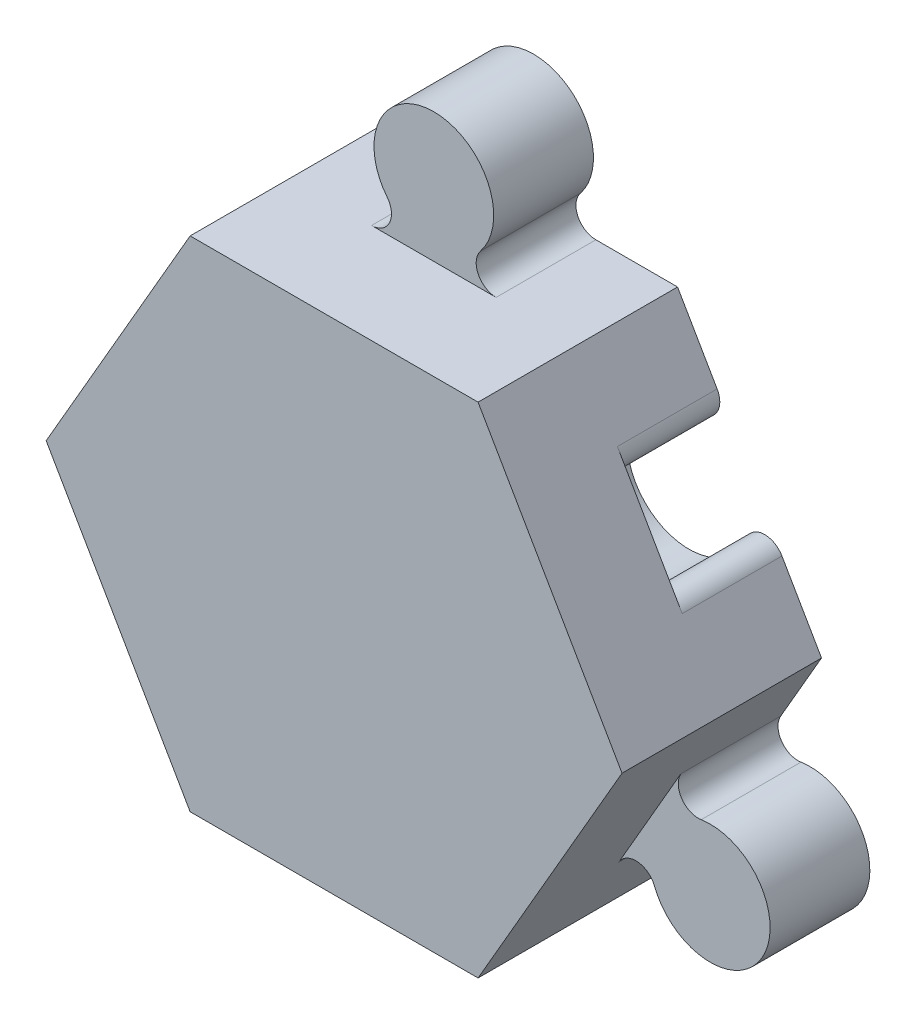
ISO-10303-21;
HEADER;
FILE_DESCRIPTION(('STEP AP214'),'2;1');
FILE_NAME('part.step','',(''),(''),'','','');
FILE_SCHEMA(('AUTOMOTIVE_DESIGN { 1 0 10303 214 1 1 1 1 }'));
ENDSEC;
DATA;
#1=APPLICATION_CONTEXT('core data for automotive mechanical design processes');
#2=APPLICATION_PROTOCOL_DEFINITION('international standard','automotive_design',2000,#1);
#3=PRODUCT_CONTEXT('',#1,'mechanical');
#4=PRODUCT('Part','Part','',(#3));
#5=PRODUCT_RELATED_PRODUCT_CATEGORY('part','',(#4));
#6=PRODUCT_DEFINITION_FORMATION('','',#4);
#7=PRODUCT_DEFINITION_CONTEXT('part definition',#1,'design');
#8=PRODUCT_DEFINITION('design','',#6,#7);
#9=PRODUCT_DEFINITION_SHAPE('','',#8);
#10=(LENGTH_UNIT() NAMED_UNIT(*) SI_UNIT(.MILLI.,.METRE.));
#11=(NAMED_UNIT(*) PLANE_ANGLE_UNIT() SI_UNIT($,.RADIAN.));
#12=(NAMED_UNIT(*) SI_UNIT($,.STERADIAN.) SOLID_ANGLE_UNIT());
#13=UNCERTAINTY_MEASURE_WITH_UNIT(LENGTH_MEASURE(1.E-05),#10,'distance_accuracy_value','');
#14=(GEOMETRIC_REPRESENTATION_CONTEXT(3) GLOBAL_UNCERTAINTY_ASSIGNED_CONTEXT((#13)) GLOBAL_UNIT_ASSIGNED_CONTEXT((#10,
#11,#12)) REPRESENTATION_CONTEXT('',''));
#15=CARTESIAN_POINT('',(0.,0.,0.));
#16=DIRECTION('',(0.,0.,1.));
#17=DIRECTION('',(1.,0.,0.));
#18=AXIS2_PLACEMENT_3D('',#15,#16,#17);
#19=CARTESIAN_POINT('',(-14.4337567297406,-1.00790384542582E-13,10.));
#20=DIRECTION('',(0.866025403784435,0.500000000000007,0.));
#21=DIRECTION('',(-0.500000000000007,0.866025403784435,0.));
#22=AXIS2_PLACEMENT_3D('',#19,#20,#21);
#23=PLANE('',#22);
#24=DIRECTION('',(0.,0.,-1.));
#25=VECTOR('',#24,1.);
#26=CARTESIAN_POINT('',(-9.26406804770591,-8.95416345659787,5.));
#27=LINE('',#26,#25);
#28=CARTESIAN_POINT('',(-9.26406804770591,-8.95416345659779,5.));
#29=VERTEX_POINT('',#28);
#30=CARTESIAN_POINT('',(-9.26406804770591,-8.95416345659787,0.));
#31=VERTEX_POINT('',#30);
#32=EDGE_CURVE('E351',#29,#31,#27,.T.);
#33=ORIENTED_EDGE('',*,*,#32,.T.);
#34=DIRECTION('',(0.500000000000007,-0.866025403784435,0.));
#35=VECTOR('',#34,1.);
#36=CARTESIAN_POINT('',(-14.4337567297406,-1.00790384542582E-13,0.));
#37=LINE('',#36,#35);
#38=CARTESIAN_POINT('',(-7.21687836487018,-12.5,0.));
#39=VERTEX_POINT('',#38);
#40=EDGE_CURVE('E525',#31,#39,#37,.T.);
#41=ORIENTED_EDGE('',*,*,#40,.T.);
#42=DIRECTION('',(0.,0.,-1.));
#43=VECTOR('',#42,1.);
#44=CARTESIAN_POINT('',(-7.21687836487018,-12.5,10.));
#45=LINE('',#44,#43);
#46=CARTESIAN_POINT('',(-7.21687836487018,-12.5,10.));
#47=VERTEX_POINT('',#46);
#48=EDGE_CURVE('E536',#47,#39,#45,.T.);
#49=ORIENTED_EDGE('',*,*,#48,.F.);
#50=DIRECTION('',(0.500000000000007,-0.866025403784435,0.));
#51=VECTOR('',#50,1.);
#52=CARTESIAN_POINT('',(-14.4337567297406,-1.00790384542582E-13,10.));
#53=LINE('',#52,#51);
#54=CARTESIAN_POINT('',(-14.4337567297406,-1.00790384542582E-13,10.));
#55=VERTEX_POINT('',#54);
#56=EDGE_CURVE('E501',#55,#47,#53,.T.);
#57=ORIENTED_EDGE('',*,*,#56,.F.);
#58=DIRECTION('',(0.,0.,-1.));
#59=VECTOR('',#58,1.);
#60=CARTESIAN_POINT('',(-14.4337567297406,-1.00790384542582E-13,10.));
#61=LINE('',#60,#59);
#62=CARTESIAN_POINT('',(-14.4337567297406,-1.00790384542582E-13,0.));
#63=VERTEX_POINT('',#62);
#64=EDGE_CURVE('E540',#55,#63,#61,.T.);
#65=ORIENTED_EDGE('',*,*,#64,.T.);
#66=CARTESIAN_POINT('',(-12.3865670469051,-3.54583654340188,0.));
#67=VERTEX_POINT('',#66);
#68=EDGE_CURVE('E526',#63,#67,#37,.T.);
#69=ORIENTED_EDGE('',*,*,#68,.T.);
#70=DIRECTION('',(0.,0.,-1.));
#71=VECTOR('',#70,1.);
#72=CARTESIAN_POINT('',(-12.3865670469051,-3.54583654340187,5.));
#73=LINE('',#72,#71);
#74=CARTESIAN_POINT('',(-12.3865670469051,-3.54583654340187,5.));
#75=VERTEX_POINT('',#74);
#76=EDGE_CURVE('E356',#75,#67,#73,.T.);
#77=ORIENTED_EDGE('',*,*,#76,.F.);
#78=DIRECTION('',(0.499999999999995,-0.866025403784442,0.));
#79=VECTOR('',#78,1.);
#80=CARTESIAN_POINT('',(-12.3865670469051,-3.54583654340187,5.));
#81=LINE('',#80,#79);
#82=EDGE_CURVE('E337',#75,#29,#81,.T.);
#83=ORIENTED_EDGE('',*,*,#82,.T.);
#84=EDGE_LOOP('',(#33,#41,#49,#57,#65,#69,#77,#83));
#85=FACE_BOUND('',#84,.T.);
#86=ADVANCED_FACE('F40',(#85),#23,.F.);
#87=CARTESIAN_POINT('',(7.21687836487044,-12.4999999999999,10.));
#88=DIRECTION('',(-0.866025403784441,0.499999999999995,0.));
#89=DIRECTION('',(-0.499999999999995,-0.866025403784441,0.));
#90=AXIS2_PLACEMENT_3D('',#87,#88,#89);
#91=PLANE('',#90);
#92=DIRECTION('',(0.,0.,-1.));
#93=VECTOR('',#92,1.);
#94=CARTESIAN_POINT('',(12.386567046905,-3.54583654340204,5.));
#95=LINE('',#94,#93);
#96=CARTESIAN_POINT('',(12.386567046905,-3.54583654340204,5.));
#97=VERTEX_POINT('',#96);
#98=CARTESIAN_POINT('',(12.386567046905,-3.54583654340204,0.));
#99=VERTEX_POINT('',#98);
#100=EDGE_CURVE('E392',#97,#99,#95,.T.);
#101=ORIENTED_EDGE('',*,*,#100,.T.);
#102=DIRECTION('',(0.499999999999995,0.866025403784441,0.));
#103=VECTOR('',#102,1.);
#104=CARTESIAN_POINT('',(7.21687836487044,-12.4999999999999,0.));
#105=LINE('',#104,#103);
#106=CARTESIAN_POINT('',(14.4337567297406,0.,0.));
#107=VERTEX_POINT('',#106);
#108=EDGE_CURVE('E477',#99,#107,#105,.T.);
#109=ORIENTED_EDGE('',*,*,#108,.T.);
#110=DIRECTION('',(0.,0.,-1.));
#111=VECTOR('',#110,1.);
#112=CARTESIAN_POINT('',(14.4337567297406,0.,10.));
#113=LINE('',#112,#111);
#114=CARTESIAN_POINT('',(14.4337567297406,0.,10.));
#115=VERTEX_POINT('',#114);
#116=EDGE_CURVE('E11',#115,#107,#113,.T.);
#117=ORIENTED_EDGE('',*,*,#116,.F.);
#118=DIRECTION('',(0.499999999999995,0.866025403784441,0.));
#119=VECTOR('',#118,1.);
#120=CARTESIAN_POINT('',(7.21687836487044,-12.4999999999999,10.));
#121=LINE('',#120,#119);
#122=CARTESIAN_POINT('',(7.21687836487044,-12.4999999999999,10.));
#123=VERTEX_POINT('',#122);
#124=EDGE_CURVE('E487',#123,#115,#121,.T.);
#125=ORIENTED_EDGE('',*,*,#124,.F.);
#126=DIRECTION('',(0.,0.,-1.));
#127=VECTOR('',#126,1.);
#128=CARTESIAN_POINT('',(7.21687836487044,-12.4999999999999,10.));
#129=LINE('',#128,#127);
#130=CARTESIAN_POINT('',(7.21687836487044,-12.4999999999999,0.));
#131=VERTEX_POINT('',#130);
#132=EDGE_CURVE('E507',#123,#131,#129,.T.);
#133=ORIENTED_EDGE('',*,*,#132,.T.);
#134=CARTESIAN_POINT('',(9.26406804770586,-8.95416345659806,0.));
#135=VERTEX_POINT('',#134);
#136=EDGE_CURVE('E508',#131,#135,#105,.T.);
#137=ORIENTED_EDGE('',*,*,#136,.T.);
#138=DIRECTION('',(0.,0.,-1.));
#139=VECTOR('',#138,1.);
#140=CARTESIAN_POINT('',(9.26406804770581,-8.95416345659802,5.));
#141=LINE('',#140,#139);
#142=CARTESIAN_POINT('',(9.26406804770581,-8.95416345659815,5.));
#143=VERTEX_POINT('',#142);
#144=EDGE_CURVE('E397',#143,#135,#141,.T.);
#145=ORIENTED_EDGE('',*,*,#144,.F.);
#146=DIRECTION('',(0.500000000000001,0.866025403784438,0.));
#147=VECTOR('',#146,1.);
#148=CARTESIAN_POINT('',(9.26406804770581,-8.95416345659802,5.));
#149=LINE('',#148,#147);
#150=EDGE_CURVE('E378',#143,#97,#149,.T.);
#151=ORIENTED_EDGE('',*,*,#150,.T.);
#152=EDGE_LOOP('',(#101,#109,#117,#125,#133,#137,#145,#151));
#153=FACE_BOUND('',#152,.T.);
#154=ADVANCED_FACE('F42',(#153),#91,.F.);
#155=CARTESIAN_POINT('',(7.21687836487027,12.5,10.));
#156=DIRECTION('',(0.,-1.,0.));
#157=DIRECTION('',(1.,0.,0.));
#158=AXIS2_PLACEMENT_3D('',#155,#156,#157);
#159=PLANE('',#158);
#160=DIRECTION('',(0.,0.,-1.));
#161=VECTOR('',#160,1.);
#162=CARTESIAN_POINT('',(-3.1224989991992,12.4999999999999,5.));
#163=LINE('',#162,#161);
#164=CARTESIAN_POINT('',(-3.1224989991992,12.4999999999999,5.));
#165=VERTEX_POINT('',#164);
#166=CARTESIAN_POINT('',(-3.1224989991992,12.4999999999999,0.));
#167=VERTEX_POINT('',#166);
#168=EDGE_CURVE('E473',#165,#167,#163,.T.);
#169=ORIENTED_EDGE('',*,*,#168,.T.);
#170=DIRECTION('',(-1.,0.,0.));
#171=VECTOR('',#170,1.);
#172=CARTESIAN_POINT('',(7.21687836487027,12.5,0.));
#173=LINE('',#172,#171);
#174=CARTESIAN_POINT('',(-7.21687836487035,12.4999999999999,0.));
#175=VERTEX_POINT('',#174);
#176=EDGE_CURVE('E516',#167,#175,#173,.T.);
#177=ORIENTED_EDGE('',*,*,#176,.T.);
#178=DIRECTION('',(0.,0.,-1.));
#179=VECTOR('',#178,1.);
#180=CARTESIAN_POINT('',(-7.21687836487035,12.4999999999999,10.));
#181=LINE('',#180,#179);
#182=CARTESIAN_POINT('',(-7.21687836487035,12.4999999999999,10.));
#183=VERTEX_POINT('',#182);
#184=EDGE_CURVE('E544',#183,#175,#181,.T.);
#185=ORIENTED_EDGE('',*,*,#184,.F.);
#186=DIRECTION('',(-1.,0.,0.));
#187=VECTOR('',#186,1.);
#188=CARTESIAN_POINT('',(7.21687836487027,12.5,10.));
#189=LINE('',#188,#187);
#190=CARTESIAN_POINT('',(7.21687836487027,12.5,10.));
#191=VERTEX_POINT('',#190);
#192=EDGE_CURVE('E495',#191,#183,#189,.T.);
#193=ORIENTED_EDGE('',*,*,#192,.F.);
#194=DIRECTION('',(0.,0.,-1.));
#195=VECTOR('',#194,1.);
#196=CARTESIAN_POINT('',(7.21687836487027,12.5,10.));
#197=LINE('',#196,#195);
#198=CARTESIAN_POINT('',(7.21687836487027,12.5,0.));
#199=VERTEX_POINT('',#198);
#200=EDGE_CURVE('E49',#191,#199,#197,.T.);
#201=ORIENTED_EDGE('',*,*,#200,.T.);
#202=CARTESIAN_POINT('',(3.1224989991992,12.5,0.));
#203=VERTEX_POINT('',#202);
#204=EDGE_CURVE('E517',#199,#203,#173,.T.);
#205=ORIENTED_EDGE('',*,*,#204,.T.);
#206=DIRECTION('',(0.,0.,-1.));
#207=VECTOR('',#206,1.);
#208=CARTESIAN_POINT('',(3.1224989991992,12.5,5.));
#209=LINE('',#208,#207);
#210=CARTESIAN_POINT('',(3.1224989991992,12.5,5.));
#211=VERTEX_POINT('',#210);
#212=EDGE_CURVE('E478',#211,#203,#209,.T.);
#213=ORIENTED_EDGE('',*,*,#212,.F.);
#214=DIRECTION('',(-1.,0.,0.));
#215=VECTOR('',#214,1.);
#216=CARTESIAN_POINT('',(3.1224989991992,12.5,5.));
#217=LINE('',#216,#215);
#218=EDGE_CURVE('E459',#211,#165,#217,.T.);
#219=ORIENTED_EDGE('',*,*,#218,.T.);
#220=EDGE_LOOP('',(#169,#177,#185,#193,#201,#205,#213,#219));
#221=FACE_BOUND('',#220,.T.);
#222=ADVANCED_FACE('F553',(#221),#159,.F.);
#223=CARTESIAN_POINT('',(14.4337567297406,0.,10.));
#224=DIRECTION('',(-0.866025403784438,-0.500000000000001,0.));
#225=DIRECTION('',(0.500000000000001,-0.866025403784438,0.));
#226=AXIS2_PLACEMENT_3D('',#223,#224,#225);
#227=PLANE('',#226);
#228=DIRECTION('',(-0.500000000000001,0.866025403784438,0.));
#229=VECTOR('',#228,1.);
#230=CARTESIAN_POINT('',(14.4337567297406,0.,0.));
#231=LINE('',#230,#229);
#232=CARTESIAN_POINT('',(12.4501252282327,3.43575054410582,0.));
#233=VERTEX_POINT('',#232);
#234=EDGE_CURVE('E512',#107,#233,#231,.T.);
#235=ORIENTED_EDGE('',*,*,#234,.T.);
#236=DIRECTION('',(0.,0.,-1.));
#237=VECTOR('',#236,1.);
#238=CARTESIAN_POINT('',(12.4501252282327,3.43575054410582,5.));
#239=LINE('',#238,#237);
#240=CARTESIAN_POINT('',(12.4501252282327,3.43575054410582,5.));
#241=VERTEX_POINT('',#240);
#242=EDGE_CURVE('E274',#241,#233,#239,.T.);
#243=ORIENTED_EDGE('',*,*,#242,.F.);
#244=DIRECTION('',(0.500000000000001,-0.866025403784438,0.));
#245=VECTOR('',#244,1.);
#246=CARTESIAN_POINT('',(10.8253175473054,6.24999999999999,5.));
#247=LINE('',#246,#245);
#248=CARTESIAN_POINT('',(9.2005098663783,9.06424945589393,5.));
#249=VERTEX_POINT('',#248);
#250=EDGE_CURVE('E299',#249,#241,#247,.T.);
#251=ORIENTED_EDGE('',*,*,#250,.F.);
#252=DIRECTION('',(0.,0.,-1.));
#253=VECTOR('',#252,1.);
#254=CARTESIAN_POINT('',(9.2005098663783,9.06424945589393,5.));
#255=LINE('',#254,#253);
#256=CARTESIAN_POINT('',(9.2005098663783,9.06424945589393,0.));
#257=VERTEX_POINT('',#256);
#258=EDGE_CURVE('E315',#249,#257,#255,.T.);
#259=ORIENTED_EDGE('',*,*,#258,.T.);
#260=EDGE_CURVE('E511',#257,#199,#231,.T.);
#261=ORIENTED_EDGE('',*,*,#260,.T.);
#262=ORIENTED_EDGE('',*,*,#200,.F.);
#263=DIRECTION('',(-0.500000000000001,0.866025403784438,0.));
#264=VECTOR('',#263,1.);
#265=CARTESIAN_POINT('',(14.4337567297406,0.,10.));
#266=LINE('',#265,#264);
#267=EDGE_CURVE('E491',#115,#191,#266,.T.);
#268=ORIENTED_EDGE('',*,*,#267,.F.);
#269=ORIENTED_EDGE('',*,*,#116,.T.);
#270=EDGE_LOOP('',(#235,#243,#251,#259,#261,#262,#268,#269));
#271=FACE_BOUND('',#270,.T.);
#272=ADVANCED_FACE('F588',(#271),#227,.F.);
#273=CARTESIAN_POINT('',(-7.21687836487035,12.4999999999999,10.));
#274=DIRECTION('',(0.866025403784442,-0.499999999999995,0.));
#275=DIRECTION('',(0.499999999999995,0.866025403784442,0.));
#276=AXIS2_PLACEMENT_3D('',#273,#274,#275);
#277=PLANE('',#276);
#278=DIRECTION('',(-0.499999999999995,-0.866025403784441,0.));
#279=VECTOR('',#278,1.);
#280=CARTESIAN_POINT('',(-7.21687836487035,12.4999999999999,0.));
#281=LINE('',#280,#279);
#282=CARTESIAN_POINT('',(-9.20050986637823,9.06424945589409,0.));
#283=VERTEX_POINT('',#282);
#284=EDGE_CURVE('E521',#175,#283,#281,.T.);
#285=ORIENTED_EDGE('',*,*,#284,.T.);
#286=DIRECTION('',(0.,0.,-1.));
#287=VECTOR('',#286,1.);
#288=CARTESIAN_POINT('',(-9.20050986637823,9.06424945589409,5.));
#289=LINE('',#288,#287);
#290=CARTESIAN_POINT('',(-9.20050986637823,9.06424945589409,5.));
#291=VERTEX_POINT('',#290);
#292=EDGE_CURVE('E277',#291,#283,#289,.T.);
#293=ORIENTED_EDGE('',*,*,#292,.F.);
#294=DIRECTION('',(0.499999999999995,0.866025403784442,0.));
#295=VECTOR('',#294,1.);
#296=CARTESIAN_POINT('',(-10.8253175473055,6.24999999999991,5.));
#297=LINE('',#296,#295);
#298=CARTESIAN_POINT('',(-12.4501252282326,3.43575054410596,5.));
#299=VERTEX_POINT('',#298);
#300=EDGE_CURVE('E246',#299,#291,#297,.T.);
#301=ORIENTED_EDGE('',*,*,#300,.F.);
#302=DIRECTION('',(0.,0.,-1.));
#303=VECTOR('',#302,1.);
#304=CARTESIAN_POINT('',(-12.4501252282326,3.43575054410596,5.));
#305=LINE('',#304,#303);
#306=CARTESIAN_POINT('',(-12.4501252282326,3.43575054410596,0.));
#307=VERTEX_POINT('',#306);
#308=EDGE_CURVE('E281',#299,#307,#305,.T.);
#309=ORIENTED_EDGE('',*,*,#308,.T.);
#310=EDGE_CURVE('E520',#307,#63,#281,.T.);
#311=ORIENTED_EDGE('',*,*,#310,.T.);
#312=ORIENTED_EDGE('',*,*,#64,.F.);
#313=DIRECTION('',(-0.499999999999995,-0.866025403784441,0.));
#314=VECTOR('',#313,1.);
#315=CARTESIAN_POINT('',(-7.21687836487035,12.4999999999999,10.));
#316=LINE('',#315,#314);
#317=EDGE_CURVE('E498',#183,#55,#316,.T.);
#318=ORIENTED_EDGE('',*,*,#317,.F.);
#319=ORIENTED_EDGE('',*,*,#184,.T.);
#320=EDGE_LOOP('',(#285,#293,#301,#309,#311,#312,#318,#319));
#321=FACE_BOUND('',#320,.T.);
#322=ADVANCED_FACE('F631',(#321),#277,.F.);
#323=CARTESIAN_POINT('',(-7.21687836487018,-12.5,10.));
#324=DIRECTION('',(0.,1.,0.));
#325=DIRECTION('',(-1.,0.,0.));
#326=AXIS2_PLACEMENT_3D('',#323,#324,#325);
#327=PLANE('',#326);
#328=DIRECTION('',(1.,0.,0.));
#329=VECTOR('',#328,1.);
#330=CARTESIAN_POINT('',(-7.21687836487018,-12.5,0.));
#331=LINE('',#330,#329);
#332=CARTESIAN_POINT('',(-3.24961536185439,-12.5,0.));
#333=VERTEX_POINT('',#332);
#334=EDGE_CURVE('E492',#39,#333,#331,.T.);
#335=ORIENTED_EDGE('',*,*,#334,.T.);
#336=DIRECTION('',(0.,0.,-1.));
#337=VECTOR('',#336,1.);
#338=CARTESIAN_POINT('',(-3.24961536185439,-12.5,5.));
#339=LINE('',#338,#337);
#340=CARTESIAN_POINT('',(-3.24961536185439,-12.5,5.));
#341=VERTEX_POINT('',#340);
#342=EDGE_CURVE('E432',#341,#333,#339,.T.);
#343=ORIENTED_EDGE('',*,*,#342,.F.);
#344=DIRECTION('',(-1.,0.,0.));
#345=VECTOR('',#344,1.);
#346=CARTESIAN_POINT('',(1.3220368468887E-13,-12.4999999999999,5.));
#347=LINE('',#346,#345);
#348=CARTESIAN_POINT('',(3.24961536185438,-12.4999999999999,5.));
#349=VERTEX_POINT('',#348);
#350=EDGE_CURVE('E418',#349,#341,#347,.T.);
#351=ORIENTED_EDGE('',*,*,#350,.F.);
#352=DIRECTION('',(0.,0.,-1.));
#353=VECTOR('',#352,1.);
#354=CARTESIAN_POINT('',(3.24961536185438,-12.4999999999999,5.));
#355=LINE('',#354,#353);
#356=CARTESIAN_POINT('',(3.24961536185438,-12.4999999999999,0.));
#357=VERTEX_POINT('',#356);
#358=EDGE_CURVE('E436',#349,#357,#355,.T.);
#359=ORIENTED_EDGE('',*,*,#358,.T.);
#360=EDGE_CURVE('E529',#357,#131,#331,.T.);
#361=ORIENTED_EDGE('',*,*,#360,.T.);
#362=ORIENTED_EDGE('',*,*,#132,.F.);
#363=DIRECTION('',(1.,0.,0.));
#364=VECTOR('',#363,1.);
#365=CARTESIAN_POINT('',(-7.21687836487018,-12.5,10.));
#366=LINE('',#365,#364);
#367=EDGE_CURVE('E504',#47,#123,#366,.T.);
#368=ORIENTED_EDGE('',*,*,#367,.F.);
#369=ORIENTED_EDGE('',*,*,#48,.T.);
#370=EDGE_LOOP('',(#335,#343,#351,#359,#361,#362,#368,#369));
#371=FACE_BOUND('',#370,.T.);
#372=ADVANCED_FACE('F629',(#371),#327,.F.);
#373=CARTESIAN_POINT('',(0.,0.,10.));
#374=DIRECTION('',(0.,0.,1.));
#375=DIRECTION('',(1.,0.,0.));
#376=AXIS2_PLACEMENT_3D('',#373,#374,#375);
#377=PLANE('',#376);
#378=ORIENTED_EDGE('',*,*,#124,.T.);
#379=ORIENTED_EDGE('',*,*,#267,.T.);
#380=ORIENTED_EDGE('',*,*,#192,.T.);
#381=ORIENTED_EDGE('',*,*,#317,.T.);
#382=ORIENTED_EDGE('',*,*,#56,.T.);
#383=ORIENTED_EDGE('',*,*,#367,.T.);
#384=EDGE_LOOP('',(#378,#379,#380,#381,#382,#383));
#385=FACE_BOUND('',#384,.T.);
#386=ADVANCED_FACE('F590',(#385),#377,.T.);
#387=CARTESIAN_POINT('',(0.,0.,0.));
#388=DIRECTION('',(0.,0.,1.));
#389=DIRECTION('',(1.,0.,0.));
#390=AXIS2_PLACEMENT_3D('',#387,#388,#389);
#391=PLANE('',#390);
#392=CARTESIAN_POINT('',(-7.79422863405995,4.50000000000005,0.));
#393=DIRECTION('',(0.,0.,-1.));
#394=DIRECTION('',(0.500000000000004,0.866025403784436,0.));
#395=AXIS2_PLACEMENT_3D('',#392,#393,#394);
#396=CIRCLE('',#395,3.1);
#397=CARTESIAN_POINT('',(-8.20271474831728,7.572969100798,0.));
#398=VERTEX_POINT('',#397);
#399=CARTESIAN_POINT('',(-10.6597409975243,3.31727480164114,0.));
#400=VERTEX_POINT('',#399);
#401=EDGE_CURVE('E265',#398,#400,#396,.T.);
#402=ORIENTED_EDGE('',*,*,#401,.F.);
#403=CARTESIAN_POINT('',(-8.33448446259384,8.56424945589411,0.));
#404=DIRECTION('',(0.,0.,-1.));
#405=DIRECTION('',(0.500000000000004,0.866025403784436,0.));
#406=AXIS2_PLACEMENT_3D('',#403,#404,#405);
#407=CIRCLE('',#406,0.999999999999999);
#408=EDGE_CURVE('E56',#283,#398,#407,.F.);
#409=ORIENTED_EDGE('',*,*,#408,.F.);
#410=ORIENTED_EDGE('',*,*,#284,.F.);
#411=ORIENTED_EDGE('',*,*,#176,.F.);
#412=CARTESIAN_POINT('',(-3.1224989991992,13.5,0.));
#413=DIRECTION('',(0.,0.,1.));
#414=DIRECTION('',(-1.,0.,0.));
#415=AXIS2_PLACEMENT_3D('',#412,#413,#414);
#416=CIRCLE('',#415,1.00000000000002);
#417=CARTESIAN_POINT('',(-2.3418742493994,14.125,0.));
#418=VERTEX_POINT('',#417);
#419=EDGE_CURVE('E435',#167,#418,#416,.T.);
#420=ORIENTED_EDGE('',*,*,#419,.T.);
#421=CARTESIAN_POINT('',(0.,16.,0.));
#422=DIRECTION('',(0.,0.,-1.));
#423=DIRECTION('',(-1.,0.,0.));
#424=AXIS2_PLACEMENT_3D('',#421,#422,#423);
#425=CIRCLE('',#424,3.);
#426=CARTESIAN_POINT('',(2.3418742493994,14.125,0.));
#427=VERTEX_POINT('',#426);
#428=EDGE_CURVE('E466',#418,#427,#425,.T.);
#429=ORIENTED_EDGE('',*,*,#428,.T.);
#430=CARTESIAN_POINT('',(3.1224989991992,13.5,0.));
#431=DIRECTION('',(0.,0.,1.));
#432=DIRECTION('',(1.,0.,0.));
#433=AXIS2_PLACEMENT_3D('',#430,#431,#432);
#434=CIRCLE('',#433,1.00000000000001);
#435=EDGE_CURVE('E451',#427,#203,#434,.T.);
#436=ORIENTED_EDGE('',*,*,#435,.T.);
#437=ORIENTED_EDGE('',*,*,#204,.F.);
#438=ORIENTED_EDGE('',*,*,#260,.F.);
#439=CARTESIAN_POINT('',(8.33448446259395,8.56424945589399,0.));
#440=DIRECTION('',(0.,0.,-1.));
#441=DIRECTION('',(0.499999999999992,-0.866025403784443,0.));
#442=AXIS2_PLACEMENT_3D('',#439,#440,#441);
#443=CIRCLE('',#442,0.999999999999999);
#444=CARTESIAN_POINT('',(8.20271474831738,7.57296910079788,0.));
#445=VERTEX_POINT('',#444);
#446=EDGE_CURVE('E292',#257,#445,#443,.T.);
#447=ORIENTED_EDGE('',*,*,#446,.T.);
#448=CARTESIAN_POINT('',(7.79422863406001,4.49999999999994,0.));
#449=DIRECTION('',(0.,0.,-1.));
#450=DIRECTION('',(0.499999999999992,-0.866025403784443,0.));
#451=AXIS2_PLACEMENT_3D('',#448,#449,#450);
#452=CIRCLE('',#451,3.1);
#453=CARTESIAN_POINT('',(10.6597409975243,3.31727480164099,0.));
#454=VERTEX_POINT('',#453);
#455=EDGE_CURVE('E306',#454,#445,#452,.T.);
#456=ORIENTED_EDGE('',*,*,#455,.F.);
#457=CARTESIAN_POINT('',(11.5840998244483,2.93575054410584,0.));
#458=DIRECTION('',(0.,0.,-1.));
#459=DIRECTION('',(0.499999999999992,-0.866025403784443,0.));
#460=AXIS2_PLACEMENT_3D('',#457,#458,#459);
#461=CIRCLE('',#460,0.999999999999999);
#462=EDGE_CURVE('E64',#233,#454,#461,.F.);
#463=ORIENTED_EDGE('',*,*,#462,.F.);
#464=ORIENTED_EDGE('',*,*,#234,.F.);
#465=ORIENTED_EDGE('',*,*,#108,.F.);
#466=CARTESIAN_POINT('',(13.2525924506895,-4.04583654340206,0.));
#467=DIRECTION('',(0.,0.,1.));
#468=DIRECTION('',(0.500000000000004,0.866025403784436,0.));
#469=AXIS2_PLACEMENT_3D('',#466,#467,#468);
#470=CIRCLE('',#469,1.00000000000002);
#471=CARTESIAN_POINT('',(13.4035459531549,-5.03437740755155,0.));
#472=VERTEX_POINT('',#471);
#473=EDGE_CURVE('E355',#99,#472,#470,.T.);
#474=ORIENTED_EDGE('',*,*,#473,.T.);
#475=CARTESIAN_POINT('',(13.856406460551,-8.00000000000005,0.));
#476=DIRECTION('',(0.,0.,-1.));
#477=DIRECTION('',(0.500000000000004,0.866025403784436,0.));
#478=AXIS2_PLACEMENT_3D('',#475,#476,#477);
#479=CIRCLE('',#478,3.);
#480=CARTESIAN_POINT('',(11.0616717037554,-9.09062259244854,0.));
#481=VERTEX_POINT('',#480);
#482=EDGE_CURVE('E385',#472,#481,#479,.T.);
#483=ORIENTED_EDGE('',*,*,#482,.T.);
#484=CARTESIAN_POINT('',(10.1300934514903,-9.45416345659803,0.));
#485=DIRECTION('',(0.,0.,1.));
#486=DIRECTION('',(-0.500000000000004,-0.866025403784436,0.));
#487=AXIS2_PLACEMENT_3D('',#484,#485,#486);
#488=CIRCLE('',#487,1.00000000000001);
#489=EDGE_CURVE('E370',#481,#135,#488,.T.);
#490=ORIENTED_EDGE('',*,*,#489,.T.);
#491=ORIENTED_EDGE('',*,*,#136,.F.);
#492=ORIENTED_EDGE('',*,*,#360,.F.);
#493=CARTESIAN_POINT('',(3.24961536185438,-11.5,0.));
#494=DIRECTION('',(0.,0.,-1.));
#495=DIRECTION('',(-1.,0.,0.));
#496=AXIS2_PLACEMENT_3D('',#493,#494,#495);
#497=CIRCLE('',#496,0.999999999999999);
#498=CARTESIAN_POINT('',(2.45702624920697,-10.890243902439,0.));
#499=VERTEX_POINT('',#498);
#500=EDGE_CURVE('E411',#357,#499,#497,.T.);
#501=ORIENTED_EDGE('',*,*,#500,.T.);
#502=CARTESIAN_POINT('',(0.,-9.00000000000002,0.));
#503=DIRECTION('',(0.,0.,-1.));
#504=DIRECTION('',(-1.,0.,0.));
#505=AXIS2_PLACEMENT_3D('',#502,#503,#504);
#506=CIRCLE('',#505,3.1);
#507=CARTESIAN_POINT('',(-2.45702624920697,-10.890243902439,0.));
#508=VERTEX_POINT('',#507);
#509=EDGE_CURVE('E425',#508,#499,#506,.T.);
#510=ORIENTED_EDGE('',*,*,#509,.F.);
#511=CARTESIAN_POINT('',(-3.24961536185439,-11.5,0.));
#512=DIRECTION('',(0.,0.,-1.));
#513=DIRECTION('',(-1.,0.,0.));
#514=AXIS2_PLACEMENT_3D('',#511,#512,#513);
#515=CIRCLE('',#514,0.999999999999999);
#516=EDGE_CURVE('E396',#333,#508,#515,.F.);
#517=ORIENTED_EDGE('',*,*,#516,.F.);
#518=ORIENTED_EDGE('',*,*,#334,.F.);
#519=ORIENTED_EDGE('',*,*,#40,.F.);
#520=CARTESIAN_POINT('',(-10.1300934514904,-9.45416345659789,0.));
#521=DIRECTION('',(0.,0.,1.));
#522=DIRECTION('',(0.499999999999992,-0.866025403784443,0.));
#523=AXIS2_PLACEMENT_3D('',#520,#521,#522);
#524=CIRCLE('',#523,1.00000000000002);
#525=CARTESIAN_POINT('',(-11.0616717037556,-9.09062259244838,0.));
#526=VERTEX_POINT('',#525);
#527=EDGE_CURVE('E280',#31,#526,#524,.T.);
#528=ORIENTED_EDGE('',*,*,#527,.T.);
#529=CARTESIAN_POINT('',(-13.8564064605511,-7.99999999999986,0.));
#530=DIRECTION('',(0.,0.,-1.));
#531=DIRECTION('',(0.499999999999992,-0.866025403784443,0.));
#532=AXIS2_PLACEMENT_3D('',#529,#530,#531);
#533=CIRCLE('',#532,3.);
#534=CARTESIAN_POINT('',(-13.4035459531549,-5.03437740755137,0.));
#535=VERTEX_POINT('',#534);
#536=EDGE_CURVE('E344',#526,#535,#533,.T.);
#537=ORIENTED_EDGE('',*,*,#536,.T.);
#538=CARTESIAN_POINT('',(-13.2525924506895,-4.04583654340187,0.));
#539=DIRECTION('',(0.,0.,1.));
#540=DIRECTION('',(-0.499999999999992,0.866025403784443,0.));
#541=AXIS2_PLACEMENT_3D('',#538,#539,#540);
#542=CIRCLE('',#541,1.00000000000001);
#543=EDGE_CURVE('E329',#535,#67,#542,.T.);
#544=ORIENTED_EDGE('',*,*,#543,.T.);
#545=ORIENTED_EDGE('',*,*,#68,.F.);
#546=ORIENTED_EDGE('',*,*,#310,.F.);
#547=CARTESIAN_POINT('',(-11.5840998244482,2.93575054410601,0.));
#548=DIRECTION('',(0.,0.,-1.));
#549=DIRECTION('',(0.500000000000004,0.866025403784436,0.));
#550=AXIS2_PLACEMENT_3D('',#547,#548,#549);
#551=CIRCLE('',#550,0.999999999999999);
#552=EDGE_CURVE('E261',#307,#400,#551,.T.);
#553=ORIENTED_EDGE('',*,*,#552,.T.);
#554=EDGE_LOOP('',(#402,#409,#410,#411,#420,#429,#436,#437,#438,#447,#456,#463,#464,#465,#474,
#483,#490,#491,#492,#501,#510,#517,#518,#519,#528,#537,#544,#545,#546,#553));
#555=FACE_BOUND('',#554,.T.);
#556=ADVANCED_FACE('F558',(#555),#391,.F.);
#557=CARTESIAN_POINT('',(-3.1224989991992,13.5,5.));
#558=DIRECTION('',(0.,0.,-1.));
#559=DIRECTION('',(-1.,0.,0.));
#560=AXIS2_PLACEMENT_3D('',#557,#558,#559);
#561=CYLINDRICAL_SURFACE('',#560,1.00000000000002);
#562=ORIENTED_EDGE('',*,*,#419,.F.);
#563=ORIENTED_EDGE('',*,*,#168,.F.);
#564=CARTESIAN_POINT('',(-3.1224989991992,13.5,5.));
#565=DIRECTION('',(0.,0.,1.));
#566=DIRECTION('',(-1.,0.,0.));
#567=AXIS2_PLACEMENT_3D('',#564,#565,#566);
#568=CIRCLE('',#567,1.00000000000002);
#569=CARTESIAN_POINT('',(-2.3418742493994,14.125,5.));
#570=VERTEX_POINT('',#569);
#571=EDGE_CURVE('E446',#165,#570,#568,.T.);
#572=ORIENTED_EDGE('',*,*,#571,.T.);
#573=DIRECTION('',(0.,0.,-1.));
#574=VECTOR('',#573,1.);
#575=CARTESIAN_POINT('',(-2.3418742493994,14.125,5.));
#576=LINE('',#575,#574);
#577=EDGE_CURVE('E462',#570,#418,#576,.T.);
#578=ORIENTED_EDGE('',*,*,#577,.T.);
#579=EDGE_LOOP('',(#562,#563,#572,#578));
#580=FACE_BOUND('',#579,.T.);
#581=ADVANCED_FACE('F570',(#580),#561,.F.);
#582=CARTESIAN_POINT('',(3.1224989991992,13.5,5.));
#583=DIRECTION('',(0.,0.,-1.));
#584=DIRECTION('',(-1.,0.,0.));
#585=AXIS2_PLACEMENT_3D('',#582,#583,#584);
#586=CYLINDRICAL_SURFACE('',#585,1.00000000000001);
#587=ORIENTED_EDGE('',*,*,#435,.F.);
#588=DIRECTION('',(0.,0.,-1.));
#589=VECTOR('',#588,1.);
#590=CARTESIAN_POINT('',(2.3418742493994,14.125,5.));
#591=LINE('',#590,#589);
#592=CARTESIAN_POINT('',(2.3418742493994,14.125,5.));
#593=VERTEX_POINT('',#592);
#594=EDGE_CURVE('E482',#593,#427,#591,.T.);
#595=ORIENTED_EDGE('',*,*,#594,.F.);
#596=CARTESIAN_POINT('',(3.1224989991992,13.5,5.));
#597=DIRECTION('',(0.,0.,1.));
#598=DIRECTION('',(1.,0.,0.));
#599=AXIS2_PLACEMENT_3D('',#596,#597,#598);
#600=CIRCLE('',#599,1.00000000000001);
#601=EDGE_CURVE('E455',#593,#211,#600,.T.);
#602=ORIENTED_EDGE('',*,*,#601,.T.);
#603=ORIENTED_EDGE('',*,*,#212,.T.);
#604=EDGE_LOOP('',(#587,#595,#602,#603));
#605=FACE_BOUND('',#604,.T.);
#606=ADVANCED_FACE('F562',(#605),#586,.F.);
#607=CARTESIAN_POINT('',(0.,16.,5.));
#608=DIRECTION('',(0.,0.,-1.));
#609=DIRECTION('',(-1.,0.,0.));
#610=AXIS2_PLACEMENT_3D('',#607,#608,#609);
#611=CYLINDRICAL_SURFACE('',#610,3.);
#612=ORIENTED_EDGE('',*,*,#428,.F.);
#613=ORIENTED_EDGE('',*,*,#577,.F.);
#614=CARTESIAN_POINT('',(0.,16.,5.));
#615=DIRECTION('',(0.,0.,-1.));
#616=DIRECTION('',(-1.,0.,0.));
#617=AXIS2_PLACEMENT_3D('',#614,#615,#616);
#618=CIRCLE('',#617,3.);
#619=EDGE_CURVE('E450',#570,#593,#618,.T.);
#620=ORIENTED_EDGE('',*,*,#619,.T.);
#621=ORIENTED_EDGE('',*,*,#594,.T.);
#622=EDGE_LOOP('',(#612,#613,#620,#621));
#623=FACE_BOUND('',#622,.T.);
#624=ADVANCED_FACE('F574',(#623),#611,.T.);
#625=CARTESIAN_POINT('',(-3.1224989991992,13.5,5.));
#626=DIRECTION('',(0.,0.,-1.));
#627=DIRECTION('',(-1.,0.,0.));
#628=AXIS2_PLACEMENT_3D('',#625,#626,#627);
#629=PLANE('',#628);
#630=ORIENTED_EDGE('',*,*,#571,.F.);
#631=ORIENTED_EDGE('',*,*,#218,.F.);
#632=ORIENTED_EDGE('',*,*,#601,.F.);
#633=ORIENTED_EDGE('',*,*,#619,.F.);
#634=EDGE_LOOP('',(#630,#631,#632,#633));
#635=FACE_BOUND('',#634,.T.);
#636=ADVANCED_FACE('F572',(#635),#629,.F.);
#637=CARTESIAN_POINT('',(-3.24961536185439,-11.5,5.));
#638=DIRECTION('',(0.,0.,-1.));
#639=DIRECTION('',(-1.,0.,0.));
#640=AXIS2_PLACEMENT_3D('',#637,#638,#639);
#641=CYLINDRICAL_SURFACE('',#640,0.999999999999999);
#642=ORIENTED_EDGE('',*,*,#516,.T.);
#643=DIRECTION('',(0.,0.,-1.));
#644=VECTOR('',#643,1.);
#645=CARTESIAN_POINT('',(-2.45702624920698,-10.890243902439,5.));
#646=LINE('',#645,#644);
#647=CARTESIAN_POINT('',(-2.45702624920698,-10.890243902439,5.));
#648=VERTEX_POINT('',#647);
#649=EDGE_CURVE('E422',#648,#508,#646,.T.);
#650=ORIENTED_EDGE('',*,*,#649,.F.);
#651=CARTESIAN_POINT('',(-3.24961536185439,-11.5,5.));
#652=DIRECTION('',(0.,0.,-1.));
#653=DIRECTION('',(-1.,0.,0.));
#654=AXIS2_PLACEMENT_3D('',#651,#652,#653);
#655=CIRCLE('',#654,0.999999999999999);
#656=EDGE_CURVE('E406',#341,#648,#655,.F.);
#657=ORIENTED_EDGE('',*,*,#656,.F.);
#658=ORIENTED_EDGE('',*,*,#342,.T.);
#659=EDGE_LOOP('',(#642,#650,#657,#658));
#660=FACE_BOUND('',#659,.T.);
#661=ADVANCED_FACE('F823',(#660),#641,.T.);
#662=CARTESIAN_POINT('',(3.24961536185438,-11.5,5.));
#663=DIRECTION('',(0.,0.,-1.));
#664=DIRECTION('',(-1.,0.,0.));
#665=AXIS2_PLACEMENT_3D('',#662,#663,#664);
#666=CYLINDRICAL_SURFACE('',#665,0.999999999999999);
#667=ORIENTED_EDGE('',*,*,#500,.F.);
#668=ORIENTED_EDGE('',*,*,#358,.F.);
#669=CARTESIAN_POINT('',(3.24961536185438,-11.5,5.));
#670=DIRECTION('',(0.,0.,-1.));
#671=DIRECTION('',(-1.,0.,0.));
#672=AXIS2_PLACEMENT_3D('',#669,#670,#671);
#673=CIRCLE('',#672,0.999999999999999);
#674=CARTESIAN_POINT('',(2.45702624920697,-10.890243902439,5.));
#675=VERTEX_POINT('',#674);
#676=EDGE_CURVE('E415',#349,#675,#673,.T.);
#677=ORIENTED_EDGE('',*,*,#676,.T.);
#678=DIRECTION('',(0.,0.,-1.));
#679=VECTOR('',#678,1.);
#680=CARTESIAN_POINT('',(2.45702624920697,-10.890243902439,5.));
#681=LINE('',#680,#679);
#682=EDGE_CURVE('E440',#675,#499,#681,.T.);
#683=ORIENTED_EDGE('',*,*,#682,.T.);
#684=EDGE_LOOP('',(#667,#668,#677,#683));
#685=FACE_BOUND('',#684,.T.);
#686=ADVANCED_FACE('F802',(#685),#666,.T.);
#687=CARTESIAN_POINT('',(0.,-9.00000000000002,5.));
#688=DIRECTION('',(0.,0.,-1.));
#689=DIRECTION('',(-1.,0.,0.));
#690=AXIS2_PLACEMENT_3D('',#687,#688,#689);
#691=CYLINDRICAL_SURFACE('',#690,3.1);
#692=ORIENTED_EDGE('',*,*,#509,.T.);
#693=ORIENTED_EDGE('',*,*,#682,.F.);
#694=CARTESIAN_POINT('',(0.,-9.00000000000002,5.));
#695=DIRECTION('',(0.,0.,-1.));
#696=DIRECTION('',(-1.,0.,0.));
#697=AXIS2_PLACEMENT_3D('',#694,#695,#696);
#698=CIRCLE('',#697,3.1);
#699=EDGE_CURVE('E410',#648,#675,#698,.T.);
#700=ORIENTED_EDGE('',*,*,#699,.F.);
#701=ORIENTED_EDGE('',*,*,#649,.T.);
#702=EDGE_LOOP('',(#692,#693,#700,#701));
#703=FACE_BOUND('',#702,.T.);
#704=ADVANCED_FACE('F807',(#703),#691,.F.);
#705=CARTESIAN_POINT('',(0.,0.,5.));
#706=DIRECTION('',(0.,0.,-1.));
#707=DIRECTION('',(-1.,0.,0.));
#708=AXIS2_PLACEMENT_3D('',#705,#706,#707);
#709=PLANE('',#708);
#710=ORIENTED_EDGE('',*,*,#656,.T.);
#711=ORIENTED_EDGE('',*,*,#699,.T.);
#712=ORIENTED_EDGE('',*,*,#676,.F.);
#713=ORIENTED_EDGE('',*,*,#350,.T.);
#714=EDGE_LOOP('',(#710,#711,#712,#713));
#715=FACE_BOUND('',#714,.T.);
#716=ADVANCED_FACE('F662',(#715),#709,.T.);
#717=CARTESIAN_POINT('',(13.2525924506895,-4.04583654340206,5.));
#718=DIRECTION('',(0.,0.,-1.));
#719=DIRECTION('',(-1.,0.,0.));
#720=AXIS2_PLACEMENT_3D('',#717,#718,#719);
#721=CYLINDRICAL_SURFACE('',#720,1.00000000000002);
#722=ORIENTED_EDGE('',*,*,#473,.F.);
#723=ORIENTED_EDGE('',*,*,#100,.F.);
#724=CARTESIAN_POINT('',(13.2525924506895,-4.04583654340206,5.));
#725=DIRECTION('',(0.,0.,1.));
#726=DIRECTION('',(0.500000000000004,0.866025403784436,0.));
#727=AXIS2_PLACEMENT_3D('',#724,#725,#726);
#728=CIRCLE('',#727,1.00000000000002);
#729=CARTESIAN_POINT('',(13.4035459531549,-5.03437740755155,5.));
#730=VERTEX_POINT('',#729);
#731=EDGE_CURVE('E365',#97,#730,#728,.T.);
#732=ORIENTED_EDGE('',*,*,#731,.T.);
#733=DIRECTION('',(0.,0.,-1.));
#734=VECTOR('',#733,1.);
#735=CARTESIAN_POINT('',(13.4035459531549,-5.03437740755155,5.));
#736=LINE('',#735,#734);
#737=EDGE_CURVE('E381',#730,#472,#736,.T.);
#738=ORIENTED_EDGE('',*,*,#737,.T.);
#739=EDGE_LOOP('',(#722,#723,#732,#738));
#740=FACE_BOUND('',#739,.T.);
#741=ADVANCED_FACE('F605',(#740),#721,.F.);
#742=CARTESIAN_POINT('',(10.1300934514903,-9.45416345659803,5.));
#743=DIRECTION('',(0.,0.,-1.));
#744=DIRECTION('',(-1.,0.,0.));
#745=AXIS2_PLACEMENT_3D('',#742,#743,#744);
#746=CYLINDRICAL_SURFACE('',#745,1.00000000000001);
#747=ORIENTED_EDGE('',*,*,#489,.F.);
#748=DIRECTION('',(0.,0.,-1.));
#749=VECTOR('',#748,1.);
#750=CARTESIAN_POINT('',(11.0616717037554,-9.09062259244854,5.));
#751=LINE('',#750,#749);
#752=CARTESIAN_POINT('',(11.0616717037554,-9.09062259244854,5.));
#753=VERTEX_POINT('',#752);
#754=EDGE_CURVE('E401',#753,#481,#751,.T.);
#755=ORIENTED_EDGE('',*,*,#754,.F.);
#756=CARTESIAN_POINT('',(10.1300934514903,-9.45416345659803,5.));
#757=DIRECTION('',(0.,0.,1.));
#758=DIRECTION('',(-0.500000000000004,-0.866025403784436,0.));
#759=AXIS2_PLACEMENT_3D('',#756,#757,#758);
#760=CIRCLE('',#759,1.00000000000001);
#761=EDGE_CURVE('E374',#753,#143,#760,.T.);
#762=ORIENTED_EDGE('',*,*,#761,.T.);
#763=ORIENTED_EDGE('',*,*,#144,.T.);
#764=EDGE_LOOP('',(#747,#755,#762,#763));
#765=FACE_BOUND('',#764,.T.);
#766=ADVANCED_FACE('F599',(#765),#746,.F.);
#767=CARTESIAN_POINT('',(13.856406460551,-8.00000000000005,5.));
#768=DIRECTION('',(0.,0.,-1.));
#769=DIRECTION('',(-1.,0.,0.));
#770=AXIS2_PLACEMENT_3D('',#767,#768,#769);
#771=CYLINDRICAL_SURFACE('',#770,3.);
#772=ORIENTED_EDGE('',*,*,#482,.F.);
#773=ORIENTED_EDGE('',*,*,#737,.F.);
#774=CARTESIAN_POINT('',(13.856406460551,-8.00000000000005,5.));
#775=DIRECTION('',(0.,0.,-1.));
#776=DIRECTION('',(0.500000000000004,0.866025403784436,0.));
#777=AXIS2_PLACEMENT_3D('',#774,#775,#776);
#778=CIRCLE('',#777,3.);
#779=EDGE_CURVE('E369',#730,#753,#778,.T.);
#780=ORIENTED_EDGE('',*,*,#779,.T.);
#781=ORIENTED_EDGE('',*,*,#754,.T.);
#782=EDGE_LOOP('',(#772,#773,#780,#781));
#783=FACE_BOUND('',#782,.T.);
#784=ADVANCED_FACE('F609',(#783),#771,.T.);
#785=CARTESIAN_POINT('',(13.2525924506895,-4.04583654340206,5.));
#786=DIRECTION('',(0.,0.,-1.));
#787=DIRECTION('',(0.500000000000004,0.866025403784436,0.));
#788=AXIS2_PLACEMENT_3D('',#785,#786,#787);
#789=PLANE('',#788);
#790=ORIENTED_EDGE('',*,*,#731,.F.);
#791=ORIENTED_EDGE('',*,*,#150,.F.);
#792=ORIENTED_EDGE('',*,*,#761,.F.);
#793=ORIENTED_EDGE('',*,*,#779,.F.);
#794=EDGE_LOOP('',(#790,#791,#792,#793));
#795=FACE_BOUND('',#794,.T.);
#796=ADVANCED_FACE('F607',(#795),#789,.F.);
#797=CARTESIAN_POINT('',(-10.1300934514904,-9.45416345659789,5.));
#798=DIRECTION('',(0.,0.,-1.));
#799=DIRECTION('',(-1.,0.,0.));
#800=AXIS2_PLACEMENT_3D('',#797,#798,#799);
#801=CYLINDRICAL_SURFACE('',#800,1.00000000000002);
#802=ORIENTED_EDGE('',*,*,#527,.F.);
#803=ORIENTED_EDGE('',*,*,#32,.F.);
#804=CARTESIAN_POINT('',(-10.1300934514904,-9.45416345659789,5.));
#805=DIRECTION('',(0.,0.,1.));
#806=DIRECTION('',(0.499999999999992,-0.866025403784443,0.));
#807=AXIS2_PLACEMENT_3D('',#804,#805,#806);
#808=CIRCLE('',#807,1.00000000000002);
#809=CARTESIAN_POINT('',(-11.0616717037556,-9.09062259244838,5.));
#810=VERTEX_POINT('',#809);
#811=EDGE_CURVE('E324',#29,#810,#808,.T.);
#812=ORIENTED_EDGE('',*,*,#811,.T.);
#813=DIRECTION('',(0.,0.,-1.));
#814=VECTOR('',#813,1.);
#815=CARTESIAN_POINT('',(-11.0616717037556,-9.09062259244838,5.));
#816=LINE('',#815,#814);
#817=EDGE_CURVE('E340',#810,#526,#816,.T.);
#818=ORIENTED_EDGE('',*,*,#817,.T.);
#819=EDGE_LOOP('',(#802,#803,#812,#818));
#820=FACE_BOUND('',#819,.T.);
#821=ADVANCED_FACE('F616',(#820),#801,.F.);
#822=CARTESIAN_POINT('',(-13.2525924506895,-4.04583654340187,5.));
#823=DIRECTION('',(0.,0.,-1.));
#824=DIRECTION('',(-1.,0.,0.));
#825=AXIS2_PLACEMENT_3D('',#822,#823,#824);
#826=CYLINDRICAL_SURFACE('',#825,1.00000000000001);
#827=ORIENTED_EDGE('',*,*,#543,.F.);
#828=DIRECTION('',(0.,0.,-1.));
#829=VECTOR('',#828,1.);
#830=CARTESIAN_POINT('',(-13.4035459531549,-5.03437740755137,5.));
#831=LINE('',#830,#829);
#832=CARTESIAN_POINT('',(-13.4035459531549,-5.03437740755137,5.));
#833=VERTEX_POINT('',#832);
#834=EDGE_CURVE('E360',#833,#535,#831,.T.);
#835=ORIENTED_EDGE('',*,*,#834,.F.);
#836=CARTESIAN_POINT('',(-13.2525924506895,-4.04583654340187,5.));
#837=DIRECTION('',(0.,0.,1.));
#838=DIRECTION('',(-0.499999999999992,0.866025403784443,0.));
#839=AXIS2_PLACEMENT_3D('',#836,#837,#838);
#840=CIRCLE('',#839,1.00000000000001);
#841=EDGE_CURVE('E333',#833,#75,#840,.T.);
#842=ORIENTED_EDGE('',*,*,#841,.T.);
#843=ORIENTED_EDGE('',*,*,#76,.T.);
#844=EDGE_LOOP('',(#827,#835,#842,#843));
#845=FACE_BOUND('',#844,.T.);
#846=ADVANCED_FACE('F686',(#845),#826,.F.);
#847=CARTESIAN_POINT('',(-13.8564064605511,-7.99999999999986,5.));
#848=DIRECTION('',(0.,0.,-1.));
#849=DIRECTION('',(-1.,0.,0.));
#850=AXIS2_PLACEMENT_3D('',#847,#848,#849);
#851=CYLINDRICAL_SURFACE('',#850,3.);
#852=ORIENTED_EDGE('',*,*,#536,.F.);
#853=ORIENTED_EDGE('',*,*,#817,.F.);
#854=CARTESIAN_POINT('',(-13.8564064605511,-7.99999999999986,5.));
#855=DIRECTION('',(0.,0.,-1.));
#856=DIRECTION('',(0.499999999999992,-0.866025403784443,0.));
#857=AXIS2_PLACEMENT_3D('',#854,#855,#856);
#858=CIRCLE('',#857,3.);
#859=EDGE_CURVE('E328',#810,#833,#858,.T.);
#860=ORIENTED_EDGE('',*,*,#859,.T.);
#861=ORIENTED_EDGE('',*,*,#834,.T.);
#862=EDGE_LOOP('',(#852,#853,#860,#861));
#863=FACE_BOUND('',#862,.T.);
#864=ADVANCED_FACE('F696',(#863),#851,.T.);
#865=CARTESIAN_POINT('',(-10.1300934514904,-9.45416345659789,5.));
#866=DIRECTION('',(0.,0.,-1.));
#867=DIRECTION('',(0.499999999999992,-0.866025403784443,0.));
#868=AXIS2_PLACEMENT_3D('',#865,#866,#867);
#869=PLANE('',#868);
#870=ORIENTED_EDGE('',*,*,#811,.F.);
#871=ORIENTED_EDGE('',*,*,#82,.F.);
#872=ORIENTED_EDGE('',*,*,#841,.F.);
#873=ORIENTED_EDGE('',*,*,#859,.F.);
#874=EDGE_LOOP('',(#870,#871,#872,#873));
#875=FACE_BOUND('',#874,.T.);
#876=ADVANCED_FACE('F706',(#875),#869,.F.);
#877=CARTESIAN_POINT('',(11.5840998244483,2.93575054410584,5.));
#878=DIRECTION('',(0.,0.,-1.));
#879=DIRECTION('',(-1.,0.,0.));
#880=AXIS2_PLACEMENT_3D('',#877,#878,#879);
#881=CYLINDRICAL_SURFACE('',#880,0.999999999999999);
#882=ORIENTED_EDGE('',*,*,#462,.T.);
#883=DIRECTION('',(0.,0.,-1.));
#884=VECTOR('',#883,1.);
#885=CARTESIAN_POINT('',(10.6597409975243,3.31727480164099,5.));
#886=LINE('',#885,#884);
#887=CARTESIAN_POINT('',(10.6597409975243,3.31727480164099,5.));
#888=VERTEX_POINT('',#887);
#889=EDGE_CURVE('E303',#888,#454,#886,.T.);
#890=ORIENTED_EDGE('',*,*,#889,.F.);
#891=CARTESIAN_POINT('',(11.5840998244483,2.93575054410584,5.));
#892=DIRECTION('',(0.,0.,-1.));
#893=DIRECTION('',(0.499999999999992,-0.866025403784443,0.));
#894=AXIS2_PLACEMENT_3D('',#891,#892,#893);
#895=CIRCLE('',#894,0.999999999999999);
#896=EDGE_CURVE('E287',#241,#888,#895,.F.);
#897=ORIENTED_EDGE('',*,*,#896,.F.);
#898=ORIENTED_EDGE('',*,*,#242,.T.);
#899=EDGE_LOOP('',(#882,#890,#897,#898));
#900=FACE_BOUND('',#899,.T.);
#901=ADVANCED_FACE('F716',(#900),#881,.T.);
#902=CARTESIAN_POINT('',(8.33448446259395,8.56424945589399,5.));
#903=DIRECTION('',(0.,0.,-1.));
#904=DIRECTION('',(-1.,0.,0.));
#905=AXIS2_PLACEMENT_3D('',#902,#903,#904);
#906=CYLINDRICAL_SURFACE('',#905,0.999999999999999);
#907=ORIENTED_EDGE('',*,*,#446,.F.);
#908=ORIENTED_EDGE('',*,*,#258,.F.);
#909=CARTESIAN_POINT('',(8.33448446259395,8.56424945589399,5.));
#910=DIRECTION('',(0.,0.,-1.));
#911=DIRECTION('',(0.499999999999992,-0.866025403784443,0.));
#912=AXIS2_PLACEMENT_3D('',#909,#910,#911);
#913=CIRCLE('',#912,0.999999999999999);
#914=CARTESIAN_POINT('',(8.20271474831738,7.57296910079788,5.));
#915=VERTEX_POINT('',#914);
#916=EDGE_CURVE('E296',#249,#915,#913,.T.);
#917=ORIENTED_EDGE('',*,*,#916,.T.);
#918=DIRECTION('',(0.,0.,-1.));
#919=VECTOR('',#918,1.);
#920=CARTESIAN_POINT('',(8.20271474831738,7.57296910079788,5.));
#921=LINE('',#920,#919);
#922=EDGE_CURVE('E319',#915,#445,#921,.T.);
#923=ORIENTED_EDGE('',*,*,#922,.T.);
#924=EDGE_LOOP('',(#907,#908,#917,#923));
#925=FACE_BOUND('',#924,.T.);
#926=ADVANCED_FACE('F726',(#925),#906,.T.);
#927=CARTESIAN_POINT('',(7.79422863406001,4.49999999999994,5.));
#928=DIRECTION('',(0.,0.,-1.));
#929=DIRECTION('',(-1.,0.,0.));
#930=AXIS2_PLACEMENT_3D('',#927,#928,#929);
#931=CYLINDRICAL_SURFACE('',#930,3.1);
#932=ORIENTED_EDGE('',*,*,#455,.T.);
#933=ORIENTED_EDGE('',*,*,#922,.F.);
#934=CARTESIAN_POINT('',(7.79422863406001,4.49999999999994,5.));
#935=DIRECTION('',(0.,0.,-1.));
#936=DIRECTION('',(0.499999999999992,-0.866025403784443,0.));
#937=AXIS2_PLACEMENT_3D('',#934,#935,#936);
#938=CIRCLE('',#937,3.1);
#939=EDGE_CURVE('E291',#888,#915,#938,.T.);
#940=ORIENTED_EDGE('',*,*,#939,.F.);
#941=ORIENTED_EDGE('',*,*,#889,.T.);
#942=EDGE_LOOP('',(#932,#933,#940,#941));
#943=FACE_BOUND('',#942,.T.);
#944=ADVANCED_FACE('F735',(#943),#931,.F.);
#945=CARTESIAN_POINT('',(0.,0.,5.));
#946=DIRECTION('',(0.,0.,-1.));
#947=DIRECTION('',(0.499999999999992,-0.866025403784443,0.));
#948=AXIS2_PLACEMENT_3D('',#945,#946,#947);
#949=PLANE('',#948);
#950=ORIENTED_EDGE('',*,*,#896,.T.);
#951=ORIENTED_EDGE('',*,*,#939,.T.);
#952=ORIENTED_EDGE('',*,*,#916,.F.);
#953=ORIENTED_EDGE('',*,*,#250,.T.);
#954=EDGE_LOOP('',(#950,#951,#952,#953));
#955=FACE_BOUND('',#954,.T.);
#956=ADVANCED_FACE('F745',(#955),#949,.T.);
#957=CARTESIAN_POINT('',(-8.33448446259384,8.56424945589411,5.));
#958=DIRECTION('',(0.,0.,-1.));
#959=DIRECTION('',(-1.,0.,0.));
#960=AXIS2_PLACEMENT_3D('',#957,#958,#959);
#961=CYLINDRICAL_SURFACE('',#960,0.999999999999999);
#962=ORIENTED_EDGE('',*,*,#408,.T.);
#963=DIRECTION('',(0.,0.,-1.));
#964=VECTOR('',#963,1.);
#965=CARTESIAN_POINT('',(-8.20271474831728,7.572969100798,5.));
#966=LINE('',#965,#964);
#967=CARTESIAN_POINT('',(-8.20271474831728,7.572969100798,5.));
#968=VERTEX_POINT('',#967);
#969=EDGE_CURVE('E235',#968,#398,#966,.T.);
#970=ORIENTED_EDGE('',*,*,#969,.F.);
#971=CARTESIAN_POINT('',(-8.33448446259384,8.56424945589411,5.));
#972=DIRECTION('',(0.,0.,-1.));
#973=DIRECTION('',(0.500000000000004,0.866025403784436,0.));
#974=AXIS2_PLACEMENT_3D('',#971,#972,#973);
#975=CIRCLE('',#974,0.999999999999999);
#976=EDGE_CURVE('E239',#291,#968,#975,.F.);
#977=ORIENTED_EDGE('',*,*,#976,.F.);
#978=ORIENTED_EDGE('',*,*,#292,.T.);
#979=EDGE_LOOP('',(#962,#970,#977,#978));
#980=FACE_BOUND('',#979,.T.);
#981=ADVANCED_FACE('F237',(#980),#961,.T.);
#982=CARTESIAN_POINT('',(-11.5840998244482,2.93575054410601,5.));
#983=DIRECTION('',(0.,0.,-1.));
#984=DIRECTION('',(-1.,0.,0.));
#985=AXIS2_PLACEMENT_3D('',#982,#983,#984);
#986=CYLINDRICAL_SURFACE('',#985,0.999999999999999);
#987=ORIENTED_EDGE('',*,*,#552,.F.);
#988=ORIENTED_EDGE('',*,*,#308,.F.);
#989=CARTESIAN_POINT('',(-11.5840998244482,2.93575054410601,5.));
#990=DIRECTION('',(0.,0.,-1.));
#991=DIRECTION('',(0.500000000000004,0.866025403784436,0.));
#992=AXIS2_PLACEMENT_3D('',#989,#990,#991);
#993=CIRCLE('',#992,0.999999999999999);
#994=CARTESIAN_POINT('',(-10.6597409975243,3.31727480164114,5.));
#995=VERTEX_POINT('',#994);
#996=EDGE_CURVE('E255',#299,#995,#993,.T.);
#997=ORIENTED_EDGE('',*,*,#996,.T.);
#998=DIRECTION('',(0.,0.,-1.));
#999=VECTOR('',#998,1.);
#1000=CARTESIAN_POINT('',(-10.6597409975243,3.31727480164114,5.));
#1001=LINE('',#1000,#999);
#1002=EDGE_CURVE('E245',#995,#400,#1001,.T.);
#1003=ORIENTED_EDGE('',*,*,#1002,.T.);
#1004=EDGE_LOOP('',(#987,#988,#997,#1003));
#1005=FACE_BOUND('',#1004,.T.);
#1006=ADVANCED_FACE('F764',(#1005),#986,.T.);
#1007=CARTESIAN_POINT('',(-7.79422863405995,4.50000000000005,5.));
#1008=DIRECTION('',(0.,0.,-1.));
#1009=DIRECTION('',(-1.,0.,0.));
#1010=AXIS2_PLACEMENT_3D('',#1007,#1008,#1009);
#1011=CYLINDRICAL_SURFACE('',#1010,3.1);
#1012=ORIENTED_EDGE('',*,*,#401,.T.);
#1013=ORIENTED_EDGE('',*,*,#1002,.F.);
#1014=CARTESIAN_POINT('',(-7.79422863405995,4.50000000000005,5.));
#1015=DIRECTION('',(0.,0.,-1.));
#1016=DIRECTION('',(0.500000000000004,0.866025403784436,0.));
#1017=AXIS2_PLACEMENT_3D('',#1014,#1015,#1016);
#1018=CIRCLE('',#1017,3.1);
#1019=EDGE_CURVE('E250',#968,#995,#1018,.T.);
#1020=ORIENTED_EDGE('',*,*,#1019,.F.);
#1021=ORIENTED_EDGE('',*,*,#969,.T.);
#1022=EDGE_LOOP('',(#1012,#1013,#1020,#1021));
#1023=FACE_BOUND('',#1022,.T.);
#1024=ADVANCED_FACE('F251',(#1023),#1011,.F.);
#1025=CARTESIAN_POINT('',(0.,0.,5.));
#1026=DIRECTION('',(0.,0.,-1.));
#1027=DIRECTION('',(0.500000000000004,0.866025403784436,0.));
#1028=AXIS2_PLACEMENT_3D('',#1025,#1026,#1027);
#1029=PLANE('',#1028);
#1030=ORIENTED_EDGE('',*,*,#976,.T.);
#1031=ORIENTED_EDGE('',*,*,#1019,.T.);
#1032=ORIENTED_EDGE('',*,*,#996,.F.);
#1033=ORIENTED_EDGE('',*,*,#300,.T.);
#1034=EDGE_LOOP('',(#1030,#1031,#1032,#1033));
#1035=FACE_BOUND('',#1034,.T.);
#1036=ADVANCED_FACE('F257',(#1035),#1029,.T.);
#1037=CLOSED_SHELL('',(#86,#154,#222,#272,#322,#372,#386,#556,#581,#606,#624,#636,#661,#686,
#704,#716,#741,#766,#784,#796,#821,#846,#864,#876,#901,#926,#944,#956,#981,#1006,#1024,#1036));
#1038=MANIFOLD_SOLID_BREP('B2',#1037);
#1039=ADVANCED_BREP_SHAPE_REPRESENTATION('',(#18,#1038),#14);
#1040=SHAPE_DEFINITION_REPRESENTATION(#9,#1039);
ENDSEC;
END-ISO-10303-21;
